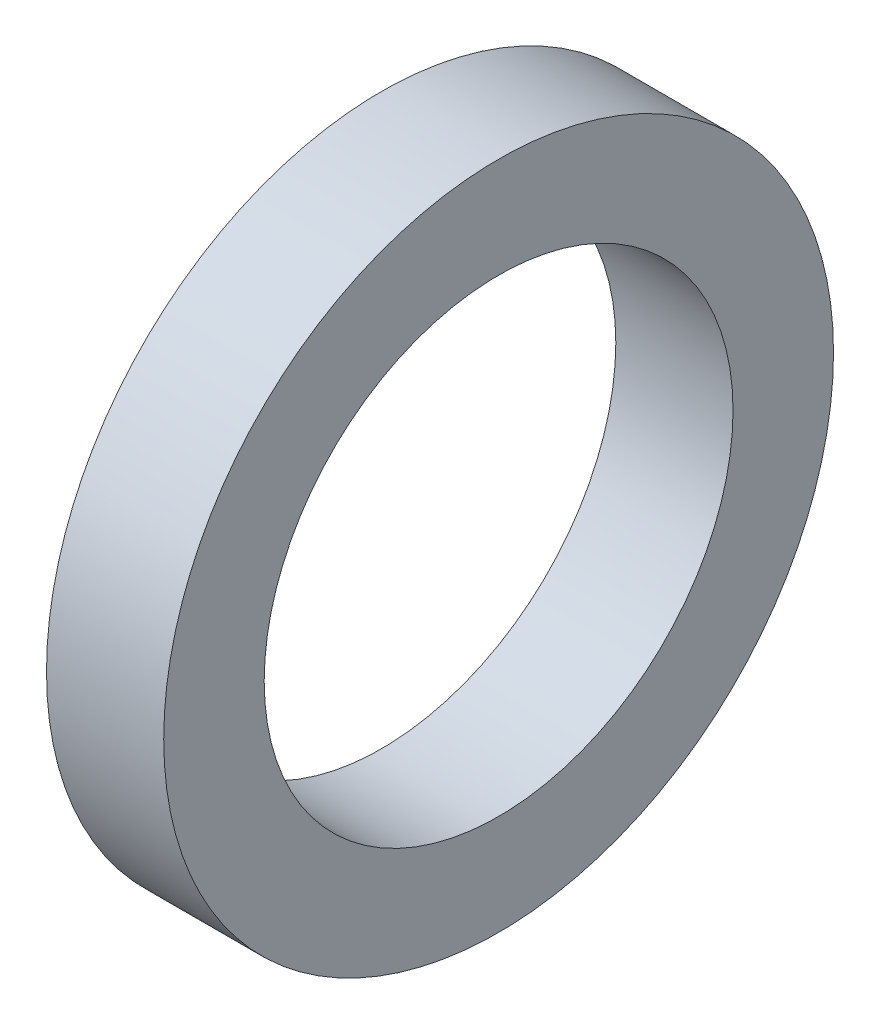
ISO-10303-21;
HEADER;
FILE_DESCRIPTION(('STEP AP214'),'2;1');
FILE_NAME('part.step','',(''),(''),'','','');
FILE_SCHEMA(('AUTOMOTIVE_DESIGN { 1 0 10303 214 1 1 1 1 }'));
ENDSEC;
DATA;
#1=APPLICATION_CONTEXT('core data for automotive mechanical design processes');
#2=APPLICATION_PROTOCOL_DEFINITION('international standard','automotive_design',2000,#1);
#3=PRODUCT_CONTEXT('',#1,'mechanical');
#4=PRODUCT('Part','Part','',(#3));
#5=PRODUCT_RELATED_PRODUCT_CATEGORY('part','',(#4));
#6=PRODUCT_DEFINITION_FORMATION('','',#4);
#7=PRODUCT_DEFINITION_CONTEXT('part definition',#1,'design');
#8=PRODUCT_DEFINITION('design','',#6,#7);
#9=PRODUCT_DEFINITION_SHAPE('','',#8);
#10=(LENGTH_UNIT() NAMED_UNIT(*) SI_UNIT(.MILLI.,.METRE.));
#11=(NAMED_UNIT(*) PLANE_ANGLE_UNIT() SI_UNIT($,.RADIAN.));
#12=(NAMED_UNIT(*) SI_UNIT($,.STERADIAN.) SOLID_ANGLE_UNIT());
#13=UNCERTAINTY_MEASURE_WITH_UNIT(LENGTH_MEASURE(1.E-05),#10,'distance_accuracy_value','');
#14=(GEOMETRIC_REPRESENTATION_CONTEXT(3) GLOBAL_UNCERTAINTY_ASSIGNED_CONTEXT((#13)) GLOBAL_UNIT_ASSIGNED_CONTEXT((#10,
#11,#12)) REPRESENTATION_CONTEXT('',''));
#15=CARTESIAN_POINT('',(0.,0.,0.));
#16=DIRECTION('',(0.,0.,1.));
#17=DIRECTION('',(1.,0.,0.));
#18=AXIS2_PLACEMENT_3D('',#15,#16,#17);
#19=CARTESIAN_POINT('',(0.,0.,0.));
#20=DIRECTION('',(-1.,0.,0.));
#21=DIRECTION('',(0.,0.,1.));
#22=AXIS2_PLACEMENT_3D('',#19,#20,#21);
#23=CYLINDRICAL_SURFACE('',#22,10.);
#24=CARTESIAN_POINT('',(0.,0.,0.));
#25=DIRECTION('',(-1.,0.,0.));
#26=DIRECTION('',(0.,0.,1.));
#27=AXIS2_PLACEMENT_3D('',#24,#25,#26);
#28=CIRCLE('',#27,10.);
#29=CARTESIAN_POINT('',(0.,0.,10.));
#30=VERTEX_POINT('',#29);
#31=EDGE_CURVE('E10',#30,#30,#28,.T.);
#32=ORIENTED_EDGE('',*,*,#31,.F.);
#33=EDGE_LOOP('',(#32));
#34=FACE_BOUND('',#33,.T.);
#35=CARTESIAN_POINT('',(3.5,0.,0.));
#36=DIRECTION('',(-1.,0.,0.));
#37=DIRECTION('',(0.,0.,1.));
#38=AXIS2_PLACEMENT_3D('',#35,#36,#37);
#39=CIRCLE('',#38,10.);
#40=CARTESIAN_POINT('',(3.5,0.,10.));
#41=VERTEX_POINT('',#40);
#42=EDGE_CURVE('E58',#41,#41,#39,.T.);
#43=ORIENTED_EDGE('',*,*,#42,.T.);
#44=EDGE_LOOP('',(#43));
#45=FACE_BOUND('',#44,.T.);
#46=ADVANCED_FACE('F41',(#34,#45),#23,.T.);
#47=CARTESIAN_POINT('',(0.,10.,0.));
#48=DIRECTION('',(1.,0.,0.));
#49=DIRECTION('',(0.,0.,-1.));
#50=AXIS2_PLACEMENT_3D('',#47,#48,#49);
#51=PLANE('',#50);
#52=CARTESIAN_POINT('',(0.,0.,0.));
#53=DIRECTION('',(-1.,0.,0.));
#54=DIRECTION('',(0.,0.,1.));
#55=AXIS2_PLACEMENT_3D('',#52,#53,#54);
#56=CIRCLE('',#55,7.);
#57=CARTESIAN_POINT('',(0.,0.,7.));
#58=VERTEX_POINT('',#57);
#59=EDGE_CURVE('E48',#58,#58,#56,.T.);
#60=ORIENTED_EDGE('',*,*,#59,.F.);
#61=EDGE_LOOP('',(#60));
#62=FACE_BOUND('',#61,.T.);
#63=ORIENTED_EDGE('',*,*,#31,.T.);
#64=EDGE_LOOP('',(#63));
#65=FACE_BOUND('',#64,.T.);
#66=ADVANCED_FACE('F74',(#62,#65),#51,.F.);
#67=CARTESIAN_POINT('',(0.,0.,0.));
#68=DIRECTION('',(-1.,0.,0.));
#69=DIRECTION('',(0.,0.,1.));
#70=AXIS2_PLACEMENT_3D('',#67,#68,#69);
#71=CYLINDRICAL_SURFACE('',#70,7.);
#72=CARTESIAN_POINT('',(3.5,0.,0.));
#73=DIRECTION('',(-1.,0.,0.));
#74=DIRECTION('',(0.,0.,1.));
#75=AXIS2_PLACEMENT_3D('',#72,#73,#74);
#76=CIRCLE('',#75,7.);
#77=CARTESIAN_POINT('',(3.5,0.,7.));
#78=VERTEX_POINT('',#77);
#79=EDGE_CURVE('E53',#78,#78,#76,.T.);
#80=ORIENTED_EDGE('',*,*,#79,.F.);
#81=EDGE_LOOP('',(#80));
#82=FACE_BOUND('',#81,.T.);
#83=ORIENTED_EDGE('',*,*,#59,.T.);
#84=EDGE_LOOP('',(#83));
#85=FACE_BOUND('',#84,.T.);
#86=ADVANCED_FACE('F69',(#82,#85),#71,.F.);
#87=CARTESIAN_POINT('',(3.5,7.,0.));
#88=DIRECTION('',(-1.,0.,0.));
#89=DIRECTION('',(0.,0.,1.));
#90=AXIS2_PLACEMENT_3D('',#87,#88,#89);
#91=PLANE('',#90);
#92=ORIENTED_EDGE('',*,*,#42,.F.);
#93=EDGE_LOOP('',(#92));
#94=FACE_BOUND('',#93,.T.);
#95=ORIENTED_EDGE('',*,*,#79,.T.);
#96=EDGE_LOOP('',(#95));
#97=FACE_BOUND('',#96,.T.);
#98=ADVANCED_FACE('F66',(#94,#97),#91,.F.);
#99=CLOSED_SHELL('',(#46,#66,#86,#98));
#100=MANIFOLD_SOLID_BREP('B2',#99);
#101=ADVANCED_BREP_SHAPE_REPRESENTATION('',(#18,#100),#14);
#102=SHAPE_DEFINITION_REPRESENTATION(#9,#101);
ENDSEC;
END-ISO-10303-21;
